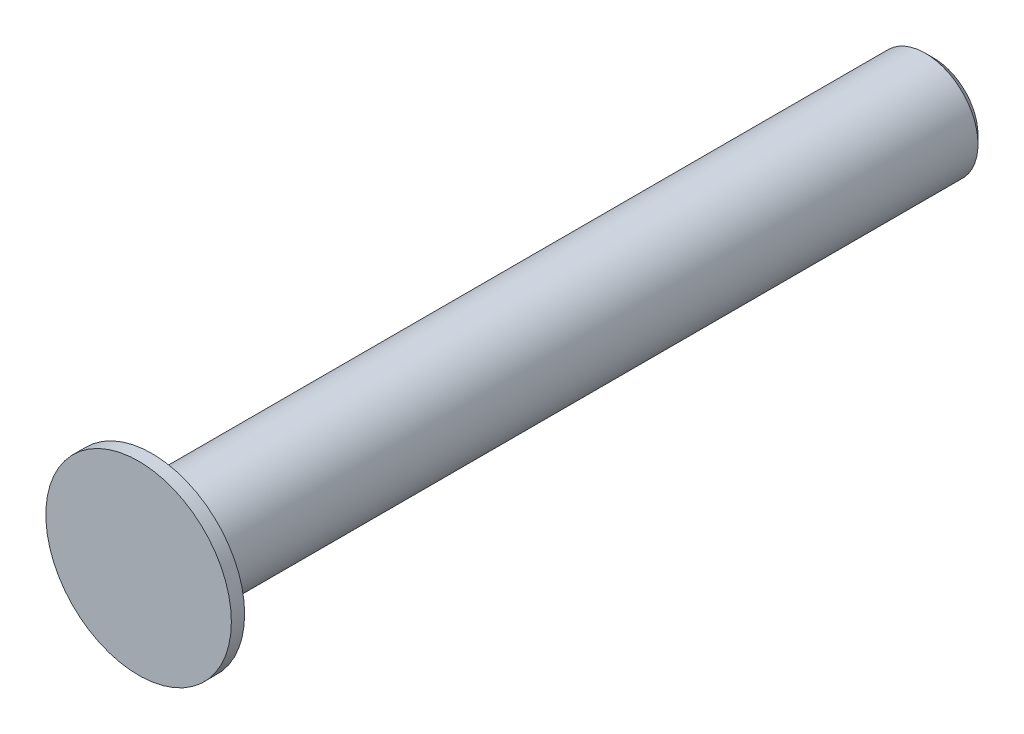
ISO-10303-21;
HEADER;
FILE_DESCRIPTION(('STEP AP214'),'2;1');
FILE_NAME('part.step','',(''),(''),'','','');
FILE_SCHEMA(('AUTOMOTIVE_DESIGN { 1 0 10303 214 1 1 1 1 }'));
ENDSEC;
DATA;
#1=APPLICATION_CONTEXT('core data for automotive mechanical design processes');
#2=APPLICATION_PROTOCOL_DEFINITION('international standard','automotive_design',2000,#1);
#3=PRODUCT_CONTEXT('',#1,'mechanical');
#4=PRODUCT('Part','Part','',(#3));
#5=PRODUCT_RELATED_PRODUCT_CATEGORY('part','',(#4));
#6=PRODUCT_DEFINITION_FORMATION('','',#4);
#7=PRODUCT_DEFINITION_CONTEXT('part definition',#1,'design');
#8=PRODUCT_DEFINITION('design','',#6,#7);
#9=PRODUCT_DEFINITION_SHAPE('','',#8);
#10=(LENGTH_UNIT() NAMED_UNIT(*) SI_UNIT(.MILLI.,.METRE.));
#11=(NAMED_UNIT(*) PLANE_ANGLE_UNIT() SI_UNIT($,.RADIAN.));
#12=(NAMED_UNIT(*) SI_UNIT($,.STERADIAN.) SOLID_ANGLE_UNIT());
#13=UNCERTAINTY_MEASURE_WITH_UNIT(LENGTH_MEASURE(1.E-05),#10,'distance_accuracy_value','');
#14=(GEOMETRIC_REPRESENTATION_CONTEXT(3) GLOBAL_UNCERTAINTY_ASSIGNED_CONTEXT((#13)) GLOBAL_UNIT_ASSIGNED_CONTEXT((#10,
#11,#12)) REPRESENTATION_CONTEXT('',''));
#15=CARTESIAN_POINT('',(0.,0.,0.));
#16=DIRECTION('',(0.,0.,1.));
#17=DIRECTION('',(1.,0.,0.));
#18=AXIS2_PLACEMENT_3D('',#15,#16,#17);
#19=CARTESIAN_POINT('',(-15.9540712568244,29.6822767505564,60.));
#20=DIRECTION('',(0.,0.,-1.));
#21=DIRECTION('',(-1.,0.,0.));
#22=AXIS2_PLACEMENT_3D('',#19,#20,#21);
#23=CYLINDRICAL_SURFACE('',#22,7.);
#24=CARTESIAN_POINT('',(-15.9540712568244,29.6822767505564,59.));
#25=DIRECTION('',(0.,0.,1.));
#26=DIRECTION('',(1.,0.,0.));
#27=AXIS2_PLACEMENT_3D('',#24,#25,#26);
#28=CIRCLE('',#27,7.);
#29=CARTESIAN_POINT('',(-8.95407125682435,29.6822767505564,59.));
#30=VERTEX_POINT('',#29);
#31=EDGE_CURVE('E55',#30,#30,#28,.T.);
#32=ORIENTED_EDGE('',*,*,#31,.T.);
#33=EDGE_LOOP('',(#32));
#34=FACE_BOUND('',#33,.T.);
#35=CARTESIAN_POINT('',(-15.9540712568244,29.6822767505564,60.));
#36=DIRECTION('',(0.,0.,1.));
#37=DIRECTION('',(1.,0.,0.));
#38=AXIS2_PLACEMENT_3D('',#35,#36,#37);
#39=CIRCLE('',#38,7.);
#40=CARTESIAN_POINT('',(-8.95407125682435,29.6822767505564,60.));
#41=VERTEX_POINT('',#40);
#42=EDGE_CURVE('E10',#41,#41,#39,.T.);
#43=ORIENTED_EDGE('',*,*,#42,.F.);
#44=EDGE_LOOP('',(#43));
#45=FACE_BOUND('',#44,.T.);
#46=ADVANCED_FACE('F43',(#34,#45),#23,.T.);
#47=CARTESIAN_POINT('',(-15.9540712568244,29.6822767505564,60.));
#48=DIRECTION('',(0.,0.,1.));
#49=DIRECTION('',(1.,0.,0.));
#50=AXIS2_PLACEMENT_3D('',#47,#48,#49);
#51=PLANE('',#50);
#52=ORIENTED_EDGE('',*,*,#42,.T.);
#53=EDGE_LOOP('',(#52));
#54=FACE_BOUND('',#53,.T.);
#55=ADVANCED_FACE('F86',(#54),#51,.T.);
#56=CARTESIAN_POINT('',(-15.9540712568244,29.6822767505564,0.));
#57=DIRECTION('',(0.,0.,1.));
#58=DIRECTION('',(1.,0.,0.));
#59=AXIS2_PLACEMENT_3D('',#56,#57,#58);
#60=CYLINDRICAL_SURFACE('',#59,3.96875);
#61=CARTESIAN_POINT('',(-15.9540712568244,29.6822767505564,59.));
#62=DIRECTION('',(0.,0.,1.));
#63=DIRECTION('',(1.,0.,0.));
#64=AXIS2_PLACEMENT_3D('',#61,#62,#63);
#65=CIRCLE('',#64,3.96875);
#66=CARTESIAN_POINT('',(-11.9853212568244,29.6822767505564,59.));
#67=VERTEX_POINT('',#66);
#68=EDGE_CURVE('E50',#67,#67,#65,.T.);
#69=ORIENTED_EDGE('',*,*,#68,.F.);
#70=EDGE_LOOP('',(#69));
#71=FACE_BOUND('',#70,.T.);
#72=CARTESIAN_POINT('',(-15.9540712568244,29.6822767505564,0.629919999999995));
#73=DIRECTION('',(0.,0.,1.));
#74=DIRECTION('',(1.,0.,0.));
#75=AXIS2_PLACEMENT_3D('',#72,#73,#74);
#76=CIRCLE('',#75,3.96875);
#77=CARTESIAN_POINT('',(-11.9853212568244,29.6822767505564,0.629919999999995));
#78=VERTEX_POINT('',#77);
#79=EDGE_CURVE('E66',#78,#78,#76,.T.);
#80=ORIENTED_EDGE('',*,*,#79,.T.);
#81=EDGE_LOOP('',(#80));
#82=FACE_BOUND('',#81,.T.);
#83=ADVANCED_FACE('F71',(#71,#82),#60,.T.);
#84=CARTESIAN_POINT('',(-11.9853212568244,29.6822767505564,59.));
#85=DIRECTION('',(0.,0.,1.));
#86=DIRECTION('',(1.,0.,0.));
#87=AXIS2_PLACEMENT_3D('',#84,#85,#86);
#88=PLANE('',#87);
#89=ORIENTED_EDGE('',*,*,#31,.F.);
#90=EDGE_LOOP('',(#89));
#91=FACE_BOUND('',#90,.T.);
#92=ORIENTED_EDGE('',*,*,#68,.T.);
#93=EDGE_LOOP('',(#92));
#94=FACE_BOUND('',#93,.T.);
#95=ADVANCED_FACE('F77',(#91,#94),#88,.F.);
#96=CARTESIAN_POINT('',(-15.9540712568244,29.6822767505564,0.));
#97=DIRECTION('',(0.,0.,1.));
#98=DIRECTION('',(1.,0.,0.));
#99=AXIS2_PLACEMENT_3D('',#96,#97,#98);
#100=CONICAL_SURFACE('',#99,3.33883,0.785398163397449);
#101=ORIENTED_EDGE('',*,*,#79,.F.);
#102=EDGE_LOOP('',(#101));
#103=FACE_BOUND('',#102,.T.);
#104=CARTESIAN_POINT('',(-15.9540712568244,29.6822767505564,0.));
#105=DIRECTION('',(0.,0.,1.));
#106=DIRECTION('',(1.,0.,0.));
#107=AXIS2_PLACEMENT_3D('',#104,#105,#106);
#108=CIRCLE('',#107,3.33883);
#109=CARTESIAN_POINT('',(-12.6152412568244,29.6822767505564,0.));
#110=VERTEX_POINT('',#109);
#111=EDGE_CURVE('E60',#110,#110,#108,.T.);
#112=ORIENTED_EDGE('',*,*,#111,.T.);
#113=EDGE_LOOP('',(#112));
#114=FACE_BOUND('',#113,.T.);
#115=ADVANCED_FACE('F73',(#103,#114),#100,.T.);
#116=CARTESIAN_POINT('',(-15.9540712568244,29.6822767505564,0.));
#117=DIRECTION('',(0.,0.,1.));
#118=DIRECTION('',(1.,0.,0.));
#119=AXIS2_PLACEMENT_3D('',#116,#117,#118);
#120=PLANE('',#119);
#121=ORIENTED_EDGE('',*,*,#111,.F.);
#122=EDGE_LOOP('',(#121));
#123=FACE_BOUND('',#122,.T.);
#124=ADVANCED_FACE('F76',(#123),#120,.F.);
#125=CLOSED_SHELL('',(#46,#55,#83,#95,#115,#124));
#126=MANIFOLD_SOLID_BREP('B2',#125);
#127=ADVANCED_BREP_SHAPE_REPRESENTATION('',(#18,#126),#14);
#128=SHAPE_DEFINITION_REPRESENTATION(#9,#127);
ENDSEC;
END-ISO-10303-21;
